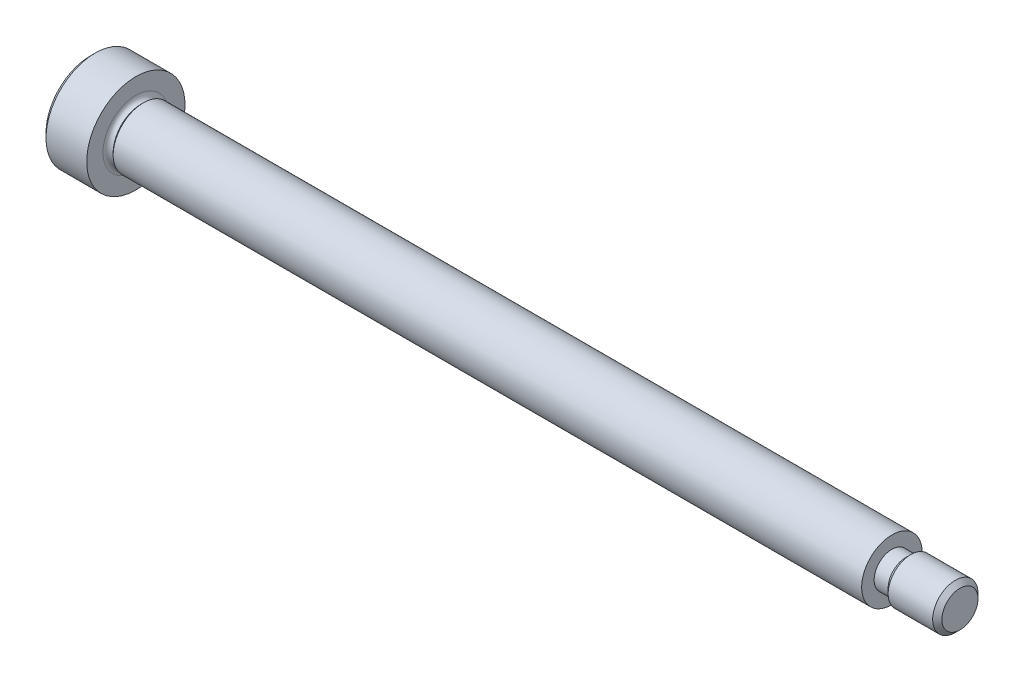
ISO-10303-21;
HEADER;
FILE_DESCRIPTION(('STEP AP214'),'2;1');
FILE_NAME('part.step','',(''),(''),'','','');
FILE_SCHEMA(('AUTOMOTIVE_DESIGN { 1 0 10303 214 1 1 1 1 }'));
ENDSEC;
DATA;
#1=APPLICATION_CONTEXT('core data for automotive mechanical design processes');
#2=APPLICATION_PROTOCOL_DEFINITION('international standard','automotive_design',2000,#1);
#3=PRODUCT_CONTEXT('',#1,'mechanical');
#4=PRODUCT('Part','Part','',(#3));
#5=PRODUCT_RELATED_PRODUCT_CATEGORY('part','',(#4));
#6=PRODUCT_DEFINITION_FORMATION('','',#4);
#7=PRODUCT_DEFINITION_CONTEXT('part definition',#1,'design');
#8=PRODUCT_DEFINITION('design','',#6,#7);
#9=PRODUCT_DEFINITION_SHAPE('','',#8);
#10=(LENGTH_UNIT() NAMED_UNIT(*) SI_UNIT(.MILLI.,.METRE.));
#11=(NAMED_UNIT(*) PLANE_ANGLE_UNIT() SI_UNIT($,.RADIAN.));
#12=(NAMED_UNIT(*) SI_UNIT($,.STERADIAN.) SOLID_ANGLE_UNIT());
#13=UNCERTAINTY_MEASURE_WITH_UNIT(LENGTH_MEASURE(1.E-05),#10,'distance_accuracy_value','');
#14=(GEOMETRIC_REPRESENTATION_CONTEXT(3) GLOBAL_UNCERTAINTY_ASSIGNED_CONTEXT((#13)) GLOBAL_UNIT_ASSIGNED_CONTEXT((#10,
#11,#12)) REPRESENTATION_CONTEXT('',''));
#15=CARTESIAN_POINT('',(0.,0.,0.));
#16=DIRECTION('',(0.,0.,1.));
#17=DIRECTION('',(1.,0.,0.));
#18=AXIS2_PLACEMENT_3D('',#15,#16,#17);
#19=CARTESIAN_POINT('',(-3.,0.,0.));
#20=DIRECTION('',(-1.,0.,0.));
#21=DIRECTION('',(0.,0.,1.));
#22=AXIS2_PLACEMENT_3D('',#19,#20,#21);
#23=PLANE('',#22);
#24=DIRECTION('',(0.,0.500000000000001,-0.866025403784438));
#25=VECTOR('',#24,1.);
#26=CARTESIAN_POINT('',(-3.,1.44337567297406,2.5));
#27=LINE('',#26,#25);
#28=CARTESIAN_POINT('',(-3.,1.44337567297406,2.5));
#29=VERTEX_POINT('',#28);
#30=CARTESIAN_POINT('',(-2.99999999994751,2.16506350946109,1.25));
#31=VERTEX_POINT('',#30);
#32=EDGE_CURVE('E160',#29,#31,#27,.T.);
#33=ORIENTED_EDGE('',*,*,#32,.T.);
#34=CARTESIAN_POINT('',(-2.99999999994751,0.,0.));
#35=DIRECTION('',(1.,0.,0.));
#36=DIRECTION('',(0.,1.,0.));
#37=AXIS2_PLACEMENT_3D('',#34,#35,#36);
#38=CIRCLE('',#37,2.50000000005271);
#39=CARTESIAN_POINT('',(-2.99999999994751,0.,2.50000000005271));
#40=VERTEX_POINT('',#39);
#41=EDGE_CURVE('E50',#31,#40,#38,.T.);
#42=ORIENTED_EDGE('',*,*,#41,.T.);
#43=DIRECTION('',(0.,1.,0.));
#44=VECTOR('',#43,1.);
#45=CARTESIAN_POINT('',(-3.,-1.44337567297406,2.5));
#46=LINE('',#45,#44);
#47=EDGE_CURVE('E460',#40,#29,#46,.T.);
#48=ORIENTED_EDGE('',*,*,#47,.T.);
#49=EDGE_LOOP('',(#33,#42,#48));
#50=FACE_BOUND('',#49,.T.);
#51=ADVANCED_FACE('F35',(#50),#23,.T.);
#52=CARTESIAN_POINT('',(-3.,-1.44337567297406,2.5));
#53=VERTEX_POINT('',#52);
#54=EDGE_CURVE('E461',#53,#40,#46,.T.);
#55=ORIENTED_EDGE('',*,*,#54,.T.);
#56=CARTESIAN_POINT('',(-2.99999999994751,-2.16506350950675,1.25000000002636));
#57=VERTEX_POINT('',#56);
#58=EDGE_CURVE('E222',#40,#57,#38,.T.);
#59=ORIENTED_EDGE('',*,*,#58,.T.);
#60=DIRECTION('',(0.,0.5,0.866025403784438));
#61=VECTOR('',#60,1.);
#62=CARTESIAN_POINT('',(-3.,-2.88675134594813,0.));
#63=LINE('',#62,#61);
#64=EDGE_CURVE('E457',#57,#53,#63,.T.);
#65=ORIENTED_EDGE('',*,*,#64,.T.);
#66=EDGE_LOOP('',(#55,#59,#65));
#67=FACE_BOUND('',#66,.T.);
#68=ADVANCED_FACE('F123',(#67),#23,.T.);
#69=CARTESIAN_POINT('',(-3.,-2.88675134594813,0.));
#70=VERTEX_POINT('',#69);
#71=EDGE_CURVE('E449',#70,#57,#63,.T.);
#72=ORIENTED_EDGE('',*,*,#71,.T.);
#73=CARTESIAN_POINT('',(-2.99999999994751,-2.16506350950674,-1.25000000002636));
#74=VERTEX_POINT('',#73);
#75=EDGE_CURVE('E469',#57,#74,#38,.T.);
#76=ORIENTED_EDGE('',*,*,#75,.T.);
#77=DIRECTION('',(0.,-0.500000000000001,0.866025403784438));
#78=VECTOR('',#77,1.);
#79=CARTESIAN_POINT('',(-3.,-1.44337567297406,-2.5));
#80=LINE('',#79,#78);
#81=EDGE_CURVE('E182',#74,#70,#80,.T.);
#82=ORIENTED_EDGE('',*,*,#81,.T.);
#83=EDGE_LOOP('',(#72,#76,#82));
#84=FACE_BOUND('',#83,.T.);
#85=ADVANCED_FACE('F129',(#84),#23,.T.);
#86=CARTESIAN_POINT('',(-3.,-1.44337567297406,-2.5));
#87=VERTEX_POINT('',#86);
#88=EDGE_CURVE('E452',#87,#74,#80,.T.);
#89=ORIENTED_EDGE('',*,*,#88,.T.);
#90=CARTESIAN_POINT('',(-2.99999999994751,0.,-2.50000000005271));
#91=VERTEX_POINT('',#90);
#92=EDGE_CURVE('E456',#74,#91,#38,.T.);
#93=ORIENTED_EDGE('',*,*,#92,.T.);
#94=DIRECTION('',(0.,-1.,0.));
#95=VECTOR('',#94,1.);
#96=CARTESIAN_POINT('',(-3.,1.44337567297406,-2.5));
#97=LINE('',#96,#95);
#98=EDGE_CURVE('E155',#91,#87,#97,.T.);
#99=ORIENTED_EDGE('',*,*,#98,.T.);
#100=EDGE_LOOP('',(#89,#93,#99));
#101=FACE_BOUND('',#100,.T.);
#102=ADVANCED_FACE('F144',(#101),#23,.T.);
#103=CARTESIAN_POINT('',(-3.,1.44337567297406,-2.5));
#104=VERTEX_POINT('',#103);
#105=EDGE_CURVE('E158',#104,#91,#97,.T.);
#106=ORIENTED_EDGE('',*,*,#105,.T.);
#107=CARTESIAN_POINT('',(-2.99999999994751,2.16506350950674,-1.25000000002636));
#108=VERTEX_POINT('',#107);
#109=EDGE_CURVE('E468',#91,#108,#38,.T.);
#110=ORIENTED_EDGE('',*,*,#109,.T.);
#111=DIRECTION('',(0.,-0.500000000000001,-0.866025403784438));
#112=VECTOR('',#111,1.);
#113=CARTESIAN_POINT('',(-3.,2.88675134594813,0.));
#114=LINE('',#113,#112);
#115=EDGE_CURVE('E156',#108,#104,#114,.T.);
#116=ORIENTED_EDGE('',*,*,#115,.T.);
#117=EDGE_LOOP('',(#106,#110,#116));
#118=FACE_BOUND('',#117,.T.);
#119=ADVANCED_FACE('F135',(#118),#23,.T.);
#120=CARTESIAN_POINT('',(-3.,2.88675134594813,0.));
#121=VERTEX_POINT('',#120);
#122=EDGE_CURVE('E148',#121,#108,#114,.T.);
#123=ORIENTED_EDGE('',*,*,#122,.T.);
#124=EDGE_CURVE('E149',#108,#31,#38,.T.);
#125=ORIENTED_EDGE('',*,*,#124,.T.);
#126=EDGE_CURVE('E151',#31,#121,#27,.T.);
#127=ORIENTED_EDGE('',*,*,#126,.T.);
#128=EDGE_LOOP('',(#123,#125,#127));
#129=FACE_BOUND('',#128,.T.);
#130=ADVANCED_FACE('F125',(#129),#23,.T.);
#131=CARTESIAN_POINT('',(100.,0.,0.));
#132=DIRECTION('',(1.,0.,0.));
#133=DIRECTION('',(0.,0.,-1.));
#134=AXIS2_PLACEMENT_3D('',#131,#132,#133);
#135=PLANE('',#134);
#136=CARTESIAN_POINT('',(100.,0.,0.));
#137=DIRECTION('',(1.,0.,0.));
#138=DIRECTION('',(0.,0.,-1.));
#139=AXIS2_PLACEMENT_3D('',#136,#137,#138);
#140=CIRCLE('',#139,4.00000000000323);
#141=CARTESIAN_POINT('',(100.,0.,-4.00000000000323));
#142=VERTEX_POINT('',#141);
#143=EDGE_CURVE('E201',#142,#142,#140,.T.);
#144=ORIENTED_EDGE('',*,*,#143,.T.);
#145=EDGE_LOOP('',(#144));
#146=FACE_BOUND('',#145,.T.);
#147=CARTESIAN_POINT('',(100.,0.,0.));
#148=DIRECTION('',(1.,0.,0.));
#149=DIRECTION('',(0.,0.,-1.));
#150=AXIS2_PLACEMENT_3D('',#147,#148,#149);
#151=CIRCLE('',#150,2.35);
#152=CARTESIAN_POINT('',(100.,0.,2.35));
#153=VERTEX_POINT('',#152);
#154=EDGE_CURVE('E197',#153,#153,#151,.T.);
#155=ORIENTED_EDGE('',*,*,#154,.F.);
#156=EDGE_LOOP('',(#155));
#157=FACE_BOUND('',#156,.T.);
#158=ADVANCED_FACE('F134',(#146,#157),#135,.T.);
#159=CARTESIAN_POINT('',(-6.,0.,0.));
#160=DIRECTION('',(1.,0.,0.));
#161=DIRECTION('',(0.,0.,-1.));
#162=AXIS2_PLACEMENT_3D('',#159,#160,#161);
#163=CYLINDRICAL_SURFACE('',#162,6.5);
#164=CARTESIAN_POINT('',(-5.38650000007122,0.,0.));
#165=DIRECTION('',(-1.,0.,0.));
#166=DIRECTION('',(0.,0.,1.));
#167=AXIS2_PLACEMENT_3D('',#164,#165,#166);
#168=CIRCLE('',#167,6.5);
#169=CARTESIAN_POINT('',(-5.38650000007122,0.,6.5));
#170=VERTEX_POINT('',#169);
#171=EDGE_CURVE('E218',#170,#170,#168,.F.);
#172=ORIENTED_EDGE('',*,*,#171,.T.);
#173=EDGE_LOOP('',(#172));
#174=FACE_BOUND('',#173,.T.);
#175=CARTESIAN_POINT('',(0.,0.,0.));
#176=DIRECTION('',(1.,0.,0.));
#177=DIRECTION('',(0.,0.,-1.));
#178=AXIS2_PLACEMENT_3D('',#175,#176,#177);
#179=CIRCLE('',#178,6.5);
#180=CARTESIAN_POINT('',(0.,0.,-6.5));
#181=VERTEX_POINT('',#180);
#182=EDGE_CURVE('E215',#181,#181,#179,.T.);
#183=ORIENTED_EDGE('',*,*,#182,.F.);
#184=EDGE_LOOP('',(#183));
#185=FACE_BOUND('',#184,.T.);
#186=ADVANCED_FACE('F141',(#174,#185),#163,.T.);
#187=CARTESIAN_POINT('',(0.,4.35,0.));
#188=DIRECTION('',(1.,0.,0.));
#189=DIRECTION('',(0.,0.,-1.));
#190=AXIS2_PLACEMENT_3D('',#187,#188,#189);
#191=PLANE('',#190);
#192=ORIENTED_EDGE('',*,*,#182,.T.);
#193=EDGE_LOOP('',(#192));
#194=FACE_BOUND('',#193,.T.);
#195=CARTESIAN_POINT('',(0.,0.,0.));
#196=DIRECTION('',(1.,0.,0.));
#197=DIRECTION('',(0.,0.,-1.));
#198=AXIS2_PLACEMENT_3D('',#195,#196,#197);
#199=CIRCLE('',#198,4.35);
#200=CARTESIAN_POINT('',(0.,0.,-4.35));
#201=VERTEX_POINT('',#200);
#202=EDGE_CURVE('E212',#201,#201,#199,.T.);
#203=ORIENTED_EDGE('',*,*,#202,.F.);
#204=EDGE_LOOP('',(#203));
#205=FACE_BOUND('',#204,.T.);
#206=ADVANCED_FACE('F271',(#194,#205),#191,.T.);
#207=CARTESIAN_POINT('',(0.63058688003833,0.,0.));
#208=DIRECTION('',(1.,0.,0.));
#209=DIRECTION('',(0.,0.,-1.));
#210=AXIS2_PLACEMENT_3D('',#207,#208,#209);
#211=TOROIDAL_SURFACE('',#210,4.32717048621621,0.630999999981046);
#212=ORIENTED_EDGE('',*,*,#202,.T.);
#213=EDGE_LOOP('',(#212));
#214=FACE_BOUND('',#213,.T.);
#215=CARTESIAN_POINT('',(0.699999999977959,0.,0.));
#216=DIRECTION('',(1.,0.,0.));
#217=DIRECTION('',(0.,0.,-1.));
#218=AXIS2_PLACEMENT_3D('',#215,#216,#217);
#219=CIRCLE('',#218,3.70000000001941);
#220=CARTESIAN_POINT('',(0.699999999977959,0.,-3.70000000001941));
#221=VERTEX_POINT('',#220);
#222=EDGE_CURVE('E209',#221,#221,#219,.T.);
#223=ORIENTED_EDGE('',*,*,#222,.F.);
#224=EDGE_LOOP('',(#223));
#225=FACE_BOUND('',#224,.T.);
#226=ADVANCED_FACE('F267',(#214,#225),#211,.F.);
#227=CARTESIAN_POINT('',(0.99999999996177,0.,0.));
#228=DIRECTION('',(1.,0.,0.));
#229=DIRECTION('',(0.,0.,-1.));
#230=AXIS2_PLACEMENT_3D('',#227,#228,#229);
#231=CONICAL_SURFACE('',#230,4.00000000000322,0.785398163397448);
#232=ORIENTED_EDGE('',*,*,#222,.T.);
#233=EDGE_LOOP('',(#232));
#234=FACE_BOUND('',#233,.T.);
#235=CARTESIAN_POINT('',(0.99999999996177,0.,0.));
#236=DIRECTION('',(1.,0.,0.));
#237=DIRECTION('',(0.,0.,-1.));
#238=AXIS2_PLACEMENT_3D('',#235,#236,#237);
#239=CIRCLE('',#238,4.00000000000322);
#240=CARTESIAN_POINT('',(0.99999999996177,0.,-4.00000000000322));
#241=VERTEX_POINT('',#240);
#242=EDGE_CURVE('E206',#241,#241,#239,.T.);
#243=ORIENTED_EDGE('',*,*,#242,.F.);
#244=EDGE_LOOP('',(#243));
#245=FACE_BOUND('',#244,.T.);
#246=ADVANCED_FACE('F263',(#234,#245),#231,.T.);
#247=CARTESIAN_POINT('',(-6.,0.,0.));
#248=DIRECTION('',(1.,0.,0.));
#249=DIRECTION('',(0.,0.,-1.));
#250=AXIS2_PLACEMENT_3D('',#247,#248,#249);
#251=CYLINDRICAL_SURFACE('',#250,4.00000000000323);
#252=ORIENTED_EDGE('',*,*,#242,.T.);
#253=EDGE_LOOP('',(#252));
#254=FACE_BOUND('',#253,.T.);
#255=ORIENTED_EDGE('',*,*,#143,.F.);
#256=EDGE_LOOP('',(#255));
#257=FACE_BOUND('',#256,.T.);
#258=ADVANCED_FACE('F257',(#254,#257),#251,.T.);
#259=CARTESIAN_POINT('',(-6.,6.5,0.));
#260=DIRECTION('',(-1.,0.,0.));
#261=DIRECTION('',(0.,0.,1.));
#262=AXIS2_PLACEMENT_3D('',#259,#260,#261);
#263=PLANE('',#262);
#264=CARTESIAN_POINT('',(-6.,0.,0.));
#265=DIRECTION('',(-1.,0.,0.));
#266=DIRECTION('',(0.,0.,1.));
#267=AXIS2_PLACEMENT_3D('',#264,#265,#266);
#268=CIRCLE('',#267,5.88650000001438);
#269=CARTESIAN_POINT('',(-6.,0.,5.88650000001438));
#270=VERTEX_POINT('',#269);
#271=EDGE_CURVE('E221',#270,#270,#268,.T.);
#272=ORIENTED_EDGE('',*,*,#271,.T.);
#273=EDGE_LOOP('',(#272));
#274=FACE_BOUND('',#273,.T.);
#275=DIRECTION('',(0.,-0.500000000000001,0.866025403784438));
#276=VECTOR('',#275,1.);
#277=CARTESIAN_POINT('',(-6.,-1.44337567297406,-2.5));
#278=LINE('',#277,#276);
#279=CARTESIAN_POINT('',(-6.,-1.44337567297406,-2.5));
#280=VERTEX_POINT('',#279);
#281=CARTESIAN_POINT('',(-6.,-2.88675134594813,0.));
#282=VERTEX_POINT('',#281);
#283=EDGE_CURVE('E58',#280,#282,#278,.T.);
#284=ORIENTED_EDGE('',*,*,#283,.F.);
#285=DIRECTION('',(0.,-1.,0.));
#286=VECTOR('',#285,1.);
#287=CARTESIAN_POINT('',(-6.,1.44337567297406,-2.5));
#288=LINE('',#287,#286);
#289=CARTESIAN_POINT('',(-6.,1.44337567297406,-2.5));
#290=VERTEX_POINT('',#289);
#291=EDGE_CURVE('E179',#290,#280,#288,.T.);
#292=ORIENTED_EDGE('',*,*,#291,.F.);
#293=DIRECTION('',(0.,-0.500000000000001,-0.866025403784438));
#294=VECTOR('',#293,1.);
#295=CARTESIAN_POINT('',(-6.,2.88675134594813,0.));
#296=LINE('',#295,#294);
#297=CARTESIAN_POINT('',(-6.,2.88675134594813,0.));
#298=VERTEX_POINT('',#297);
#299=EDGE_CURVE('E176',#298,#290,#296,.T.);
#300=ORIENTED_EDGE('',*,*,#299,.F.);
#301=DIRECTION('',(0.,0.500000000000001,-0.866025403784438));
#302=VECTOR('',#301,1.);
#303=CARTESIAN_POINT('',(-6.,1.44337567297406,2.5));
#304=LINE('',#303,#302);
#305=CARTESIAN_POINT('',(-6.,1.44337567297406,2.5));
#306=VERTEX_POINT('',#305);
#307=EDGE_CURVE('E173',#306,#298,#304,.T.);
#308=ORIENTED_EDGE('',*,*,#307,.F.);
#309=DIRECTION('',(0.,1.,0.));
#310=VECTOR('',#309,1.);
#311=CARTESIAN_POINT('',(-6.,-1.44337567297406,2.5));
#312=LINE('',#311,#310);
#313=CARTESIAN_POINT('',(-6.,-1.44337567297406,2.5));
#314=VERTEX_POINT('',#313);
#315=EDGE_CURVE('E170',#314,#306,#312,.T.);
#316=ORIENTED_EDGE('',*,*,#315,.F.);
#317=DIRECTION('',(0.,0.5,0.866025403784438));
#318=VECTOR('',#317,1.);
#319=CARTESIAN_POINT('',(-6.,-2.88675134594813,0.));
#320=LINE('',#319,#318);
#321=EDGE_CURVE('E167',#282,#314,#320,.T.);
#322=ORIENTED_EDGE('',*,*,#321,.F.);
#323=EDGE_LOOP('',(#284,#292,#300,#308,#316,#322));
#324=FACE_BOUND('',#323,.T.);
#325=ADVANCED_FACE('F250',(#274,#324),#263,.T.);
#326=CARTESIAN_POINT('',(101.85,0.,0.));
#327=DIRECTION('',(-1.,0.,0.));
#328=DIRECTION('',(0.,0.,1.));
#329=AXIS2_PLACEMENT_3D('',#326,#327,#328);
#330=CYLINDRICAL_SURFACE('',#329,2.35);
#331=CARTESIAN_POINT('',(101.85,0.,0.));
#332=DIRECTION('',(1.,0.,0.));
#333=DIRECTION('',(0.,0.,-1.));
#334=AXIS2_PLACEMENT_3D('',#331,#332,#333);
#335=CIRCLE('',#334,2.35);
#336=CARTESIAN_POINT('',(101.85,0.,2.35));
#337=VERTEX_POINT('',#336);
#338=EDGE_CURVE('E198',#337,#337,#335,.T.);
#339=CARTESIAN_POINT('',(101.85,0.,2.35));
#340=CARTESIAN_POINT('',(101.830729166667,0.,2.35));
#341=CARTESIAN_POINT('',(101.811458333333,0.,2.35));
#342=CARTESIAN_POINT('',(101.772916666667,0.,2.35));
#343=CARTESIAN_POINT('',(101.753645833333,0.,2.35));
#344=CARTESIAN_POINT('',(101.715104166667,0.,2.35));
#345=CARTESIAN_POINT('',(101.695833333333,0.,2.35));
#346=CARTESIAN_POINT('',(101.657291666667,0.,2.35));
#347=CARTESIAN_POINT('',(101.638020833333,0.,2.35));
#348=CARTESIAN_POINT('',(101.599479166667,0.,2.35));
#349=CARTESIAN_POINT('',(101.580208333333,0.,2.35));
#350=CARTESIAN_POINT('',(101.541666666667,0.,2.35));
#351=CARTESIAN_POINT('',(101.522395833333,0.,2.35));
#352=CARTESIAN_POINT('',(101.483854166667,0.,2.35));
#353=CARTESIAN_POINT('',(101.464583333333,0.,2.35));
#354=CARTESIAN_POINT('',(101.426041666667,0.,2.35));
#355=CARTESIAN_POINT('',(101.406770833333,0.,2.35));
#356=CARTESIAN_POINT('',(101.368229166667,0.,2.35));
#357=CARTESIAN_POINT('',(101.348958333333,0.,2.35));
#358=CARTESIAN_POINT('',(101.310416666667,0.,2.35));
#359=CARTESIAN_POINT('',(101.291145833333,0.,2.35));
#360=CARTESIAN_POINT('',(101.252604166667,0.,2.35));
#361=CARTESIAN_POINT('',(101.233333333333,0.,2.35));
#362=CARTESIAN_POINT('',(101.194791666667,0.,2.35));
#363=CARTESIAN_POINT('',(101.175520833333,0.,2.35));
#364=CARTESIAN_POINT('',(101.136979166667,0.,2.35));
#365=CARTESIAN_POINT('',(101.117708333333,0.,2.35));
#366=CARTESIAN_POINT('',(101.079166666667,0.,2.35));
#367=CARTESIAN_POINT('',(101.059895833333,0.,2.35));
#368=CARTESIAN_POINT('',(101.021354166667,0.,2.35));
#369=CARTESIAN_POINT('',(101.002083333333,0.,2.35));
#370=CARTESIAN_POINT('',(100.963541666667,0.,2.35));
#371=CARTESIAN_POINT('',(100.944270833333,0.,2.35));
#372=CARTESIAN_POINT('',(100.905729166667,0.,2.35));
#373=CARTESIAN_POINT('',(100.886458333333,0.,2.35));
#374=CARTESIAN_POINT('',(100.847916666667,0.,2.35));
#375=CARTESIAN_POINT('',(100.828645833333,0.,2.35));
#376=CARTESIAN_POINT('',(100.790104166667,0.,2.35));
#377=CARTESIAN_POINT('',(100.770833333333,0.,2.35));
#378=CARTESIAN_POINT('',(100.732291666667,0.,2.35));
#379=CARTESIAN_POINT('',(100.713020833333,0.,2.35));
#380=CARTESIAN_POINT('',(100.674479166667,0.,2.35));
#381=CARTESIAN_POINT('',(100.655208333333,0.,2.35));
#382=CARTESIAN_POINT('',(100.616666666667,0.,2.35));
#383=CARTESIAN_POINT('',(100.597395833333,0.,2.35));
#384=CARTESIAN_POINT('',(100.558854166667,0.,2.35));
#385=CARTESIAN_POINT('',(100.539583333333,0.,2.35));
#386=CARTESIAN_POINT('',(100.501041666667,0.,2.35));
#387=CARTESIAN_POINT('',(100.481770833333,0.,2.35));
#388=CARTESIAN_POINT('',(100.443229166667,0.,2.35));
#389=CARTESIAN_POINT('',(100.423958333333,0.,2.35));
#390=CARTESIAN_POINT('',(100.385416666667,0.,2.35));
#391=CARTESIAN_POINT('',(100.366145833333,0.,2.35));
#392=CARTESIAN_POINT('',(100.327604166667,0.,2.35));
#393=CARTESIAN_POINT('',(100.308333333333,0.,2.35));
#394=CARTESIAN_POINT('',(100.269791666667,0.,2.35));
#395=CARTESIAN_POINT('',(100.250520833333,0.,2.35));
#396=CARTESIAN_POINT('',(100.211979166667,0.,2.35));
#397=CARTESIAN_POINT('',(100.192708333333,0.,2.35));
#398=CARTESIAN_POINT('',(100.154166666667,0.,2.35));
#399=CARTESIAN_POINT('',(100.134895833333,0.,2.35));
#400=CARTESIAN_POINT('',(100.096354166667,0.,2.35));
#401=CARTESIAN_POINT('',(100.077083333333,0.,2.35));
#402=CARTESIAN_POINT('',(100.038541666667,0.,2.35));
#403=CARTESIAN_POINT('',(100.019270833333,0.,2.35));
#404=CARTESIAN_POINT('',(100.,0.,2.35));
#405=B_SPLINE_CURVE_WITH_KNOTS('',3,(#339,#340,#341,#342,#343,#344,#345,#346,#347,#348,#349,
#350,#351,#352,#353,#354,#355,#356,#357,#358,#359,#360,#361,#362,#363,#364,#365,#366,#367,#368,
#369,#370,#371,#372,#373,#374,#375,#376,#377,#378,#379,#380,#381,#382,#383,#384,#385,#386,#387,
#388,#389,#390,#391,#392,#393,#394,#395,#396,#397,#398,#399,#400,#401,#402,#403,#404),
.UNSPECIFIED.,.F.,.F.,(4,2,2,2,2,2,2,2,2,2,2,2,2,2,2,2,2,2,2,2,2,2,2,2,2,2,2,2,2,2,2,2,4),(0.,
0.057812500000004,0.115625000000008,0.173437500000012,0.231250000000002,0.289062500000006,
0.34687500000001,0.404687500000001,0.462500000000005,0.520312500000009,0.578124999999999,
0.635937500000003,0.693750000000007,0.751562499999997,0.809375000000001,0.867187500000005,
0.924999999999995,0.982812499999999,1.040625,1.09843750000001,1.15625,1.2140625,
1.27187500000001,1.3296875,1.3875,1.4453125,1.50312499999999,1.5609375,1.61875,1.67656249999999,
1.734375,1.7921875,1.84999999999999),.UNSPECIFIED.);
#406=EDGE_CURVE('BSEAM244',#337,#153,#405,.T.);
#407=ORIENTED_EDGE('',*,*,#338,.F.);
#408=ORIENTED_EDGE('',*,*,#154,.T.);
#409=ORIENTED_EDGE('',*,*,#406,.T.);
#410=ORIENTED_EDGE('',*,*,#406,.F.);
#411=EDGE_LOOP('',(#407,#409,#408,#410));
#412=FACE_BOUND('',#411,.T.);
#413=ADVANCED_FACE('F244',(#412),#330,.T.);
#414=CARTESIAN_POINT('',(101.85,0.,0.));
#415=DIRECTION('',(1.,0.,0.));
#416=DIRECTION('',(0.,0.,-1.));
#417=AXIS2_PLACEMENT_3D('',#414,#415,#416);
#418=CONICAL_SURFACE('',#417,2.34999999997453,0.785398163397452);
#419=CARTESIAN_POINT('',(102.500000000011,0.,0.));
#420=DIRECTION('',(1.,0.,0.));
#421=DIRECTION('',(0.,0.,-1.));
#422=AXIS2_PLACEMENT_3D('',#419,#420,#421);
#423=CIRCLE('',#422,2.99999999998591);
#424=CARTESIAN_POINT('',(102.500000000011,0.,-2.99999999998591));
#425=VERTEX_POINT('',#424);
#426=EDGE_CURVE('E185',#425,#425,#423,.T.);
#427=ORIENTED_EDGE('',*,*,#426,.F.);
#428=EDGE_LOOP('',(#427));
#429=FACE_BOUND('',#428,.T.);
#430=ORIENTED_EDGE('',*,*,#338,.T.);
#431=EDGE_LOOP('',(#430));
#432=FACE_BOUND('',#431,.T.);
#433=ADVANCED_FACE('F238',(#429,#432),#418,.T.);
#434=CARTESIAN_POINT('',(109.,0.,0.));
#435=DIRECTION('',(-1.,0.,0.));
#436=DIRECTION('',(0.,0.,1.));
#437=AXIS2_PLACEMENT_3D('',#434,#435,#436);
#438=CYLINDRICAL_SURFACE('',#437,3.);
#439=CARTESIAN_POINT('',(108.386500000014,0.,0.));
#440=DIRECTION('',(1.,0.,0.));
#441=DIRECTION('',(0.,0.,-1.));
#442=AXIS2_PLACEMENT_3D('',#439,#440,#441);
#443=CIRCLE('',#442,3.);
#444=CARTESIAN_POINT('',(108.386500000014,0.,-3.));
#445=VERTEX_POINT('',#444);
#446=EDGE_CURVE('E11',#445,#445,#443,.F.);
#447=ORIENTED_EDGE('',*,*,#446,.T.);
#448=EDGE_LOOP('',(#447));
#449=FACE_BOUND('',#448,.T.);
#450=ORIENTED_EDGE('',*,*,#426,.T.);
#451=EDGE_LOOP('',(#450));
#452=FACE_BOUND('',#451,.T.);
#453=ADVANCED_FACE('F235',(#449,#452),#438,.T.);
#454=CARTESIAN_POINT('',(109.,0.,0.));
#455=DIRECTION('',(1.,0.,0.));
#456=DIRECTION('',(0.,0.,-1.));
#457=AXIS2_PLACEMENT_3D('',#454,#455,#456);
#458=PLANE('',#457);
#459=CARTESIAN_POINT('',(109.,0.,0.));
#460=DIRECTION('',(1.,0.,0.));
#461=DIRECTION('',(0.,0.,-1.));
#462=AXIS2_PLACEMENT_3D('',#459,#460,#461);
#463=CIRCLE('',#462,2.38650000007123);
#464=CARTESIAN_POINT('',(109.,0.,-2.38650000007123));
#465=VERTEX_POINT('',#464);
#466=EDGE_CURVE('E43',#465,#465,#463,.T.);
#467=ORIENTED_EDGE('',*,*,#466,.T.);
#468=EDGE_LOOP('',(#467));
#469=FACE_BOUND('',#468,.T.);
#470=ADVANCED_FACE('F227',(#469),#458,.T.);
#471=CARTESIAN_POINT('',(-3.,-1.44337567297406,-2.5));
#472=DIRECTION('',(0.,-0.866025403784438,-0.500000000000001));
#473=DIRECTION('',(0.,0.500000000000001,-0.866025403784438));
#474=AXIS2_PLACEMENT_3D('',#471,#472,#473);
#475=PLANE('',#474);
#476=ORIENTED_EDGE('',*,*,#283,.T.);
#477=DIRECTION('',(-1.,0.,0.));
#478=VECTOR('',#477,1.);
#479=CARTESIAN_POINT('',(-3.,-2.88675134594813,0.));
#480=LINE('',#479,#478);
#481=EDGE_CURVE('E165',#70,#282,#480,.T.);
#482=ORIENTED_EDGE('',*,*,#481,.F.);
#483=ORIENTED_EDGE('',*,*,#81,.F.);
#484=ORIENTED_EDGE('',*,*,#88,.F.);
#485=DIRECTION('',(-1.,0.,0.));
#486=VECTOR('',#485,1.);
#487=CARTESIAN_POINT('',(-3.,-1.44337567297406,-2.5));
#488=LINE('',#487,#486);
#489=EDGE_CURVE('E183',#87,#280,#488,.T.);
#490=ORIENTED_EDGE('',*,*,#489,.T.);
#491=EDGE_LOOP('',(#476,#482,#483,#484,#490));
#492=FACE_BOUND('',#491,.T.);
#493=ADVANCED_FACE('F331',(#492),#475,.F.);
#494=CARTESIAN_POINT('',(-3.,1.44337567297406,-2.5));
#495=DIRECTION('',(0.,0.,-1.));
#496=DIRECTION('',(0.,1.,0.));
#497=AXIS2_PLACEMENT_3D('',#494,#495,#496);
#498=PLANE('',#497);
#499=ORIENTED_EDGE('',*,*,#291,.T.);
#500=ORIENTED_EDGE('',*,*,#489,.F.);
#501=ORIENTED_EDGE('',*,*,#98,.F.);
#502=ORIENTED_EDGE('',*,*,#105,.F.);
#503=DIRECTION('',(-1.,0.,0.));
#504=VECTOR('',#503,1.);
#505=CARTESIAN_POINT('',(-3.,1.44337567297406,-2.5));
#506=LINE('',#505,#504);
#507=EDGE_CURVE('E186',#104,#290,#506,.T.);
#508=ORIENTED_EDGE('',*,*,#507,.T.);
#509=EDGE_LOOP('',(#499,#500,#501,#502,#508));
#510=FACE_BOUND('',#509,.T.);
#511=ADVANCED_FACE('F414',(#510),#498,.F.);
#512=CARTESIAN_POINT('',(-3.,2.88675134594813,0.));
#513=DIRECTION('',(0.,0.866025403784438,-0.500000000000001));
#514=DIRECTION('',(0.,0.500000000000001,0.866025403784438));
#515=AXIS2_PLACEMENT_3D('',#512,#513,#514);
#516=PLANE('',#515);
#517=ORIENTED_EDGE('',*,*,#299,.T.);
#518=ORIENTED_EDGE('',*,*,#507,.F.);
#519=ORIENTED_EDGE('',*,*,#115,.F.);
#520=ORIENTED_EDGE('',*,*,#122,.F.);
#521=DIRECTION('',(-1.,0.,0.));
#522=VECTOR('',#521,1.);
#523=CARTESIAN_POINT('',(-3.,2.88675134594813,0.));
#524=LINE('',#523,#522);
#525=EDGE_CURVE('E188',#121,#298,#524,.T.);
#526=ORIENTED_EDGE('',*,*,#525,.T.);
#527=EDGE_LOOP('',(#517,#518,#519,#520,#526));
#528=FACE_BOUND('',#527,.T.);
#529=ADVANCED_FACE('F405',(#528),#516,.F.);
#530=CARTESIAN_POINT('',(-3.,1.44337567297406,2.5));
#531=DIRECTION('',(0.,0.866025403784438,0.500000000000001));
#532=DIRECTION('',(0.,-0.500000000000001,0.866025403784438));
#533=AXIS2_PLACEMENT_3D('',#530,#531,#532);
#534=PLANE('',#533);
#535=ORIENTED_EDGE('',*,*,#307,.T.);
#536=ORIENTED_EDGE('',*,*,#525,.F.);
#537=ORIENTED_EDGE('',*,*,#126,.F.);
#538=ORIENTED_EDGE('',*,*,#32,.F.);
#539=DIRECTION('',(-1.,0.,0.));
#540=VECTOR('',#539,1.);
#541=CARTESIAN_POINT('',(-3.,1.44337567297406,2.5));
#542=LINE('',#541,#540);
#543=EDGE_CURVE('E190',#29,#306,#542,.T.);
#544=ORIENTED_EDGE('',*,*,#543,.T.);
#545=EDGE_LOOP('',(#535,#536,#537,#538,#544));
#546=FACE_BOUND('',#545,.T.);
#547=ADVANCED_FACE('F396',(#546),#534,.F.);
#548=CARTESIAN_POINT('',(-3.,-1.44337567297406,2.5));
#549=DIRECTION('',(0.,0.,1.));
#550=DIRECTION('',(0.,-1.,0.));
#551=AXIS2_PLACEMENT_3D('',#548,#549,#550);
#552=PLANE('',#551);
#553=ORIENTED_EDGE('',*,*,#315,.T.);
#554=ORIENTED_EDGE('',*,*,#543,.F.);
#555=ORIENTED_EDGE('',*,*,#47,.F.);
#556=ORIENTED_EDGE('',*,*,#54,.F.);
#557=DIRECTION('',(-1.,0.,0.));
#558=VECTOR('',#557,1.);
#559=CARTESIAN_POINT('',(-3.,-1.44337567297406,2.5));
#560=LINE('',#559,#558);
#561=EDGE_CURVE('E192',#53,#314,#560,.T.);
#562=ORIENTED_EDGE('',*,*,#561,.T.);
#563=EDGE_LOOP('',(#553,#554,#555,#556,#562));
#564=FACE_BOUND('',#563,.T.);
#565=ADVANCED_FACE('F118',(#564),#552,.F.);
#566=CARTESIAN_POINT('',(-3.,-2.88675134594813,0.));
#567=DIRECTION('',(0.,-0.866025403784438,0.500000000000001));
#568=DIRECTION('',(0.,-0.500000000000001,-0.866025403784438));
#569=AXIS2_PLACEMENT_3D('',#566,#567,#568);
#570=PLANE('',#569);
#571=ORIENTED_EDGE('',*,*,#321,.T.);
#572=ORIENTED_EDGE('',*,*,#561,.F.);
#573=ORIENTED_EDGE('',*,*,#64,.F.);
#574=ORIENTED_EDGE('',*,*,#71,.F.);
#575=ORIENTED_EDGE('',*,*,#481,.T.);
#576=EDGE_LOOP('',(#571,#572,#573,#574,#575));
#577=FACE_BOUND('',#576,.T.);
#578=ADVANCED_FACE('F111',(#577),#570,.F.);
#579=CARTESIAN_POINT('',(-1.55662432694301,0.,0.));
#580=DIRECTION('',(-1.,0.,0.));
#581=DIRECTION('',(0.,-1.,0.));
#582=AXIS2_PLACEMENT_3D('',#579,#580,#581);
#583=CONICAL_SURFACE('',#582,0.,1.0471975511966);
#584=ORIENTED_EDGE('',*,*,#41,.F.);
#585=ORIENTED_EDGE('',*,*,#124,.F.);
#586=ORIENTED_EDGE('',*,*,#109,.F.);
#587=ORIENTED_EDGE('',*,*,#92,.F.);
#588=ORIENTED_EDGE('',*,*,#75,.F.);
#589=ORIENTED_EDGE('',*,*,#58,.F.);
#590=EDGE_LOOP('',(#584,#585,#586,#587,#588,#589));
#591=FACE_BOUND('',#590,.T.);
#592=CARTESIAN_POINT('',(-1.55662432694301,0.,0.));
#593=VERTEX_POINT('',#592);
#594=VERTEX_LOOP('',#593);
#595=FACE_BOUND('',#594,.T.);
#596=ADVANCED_FACE('F108',(#591,#595),#583,.F.);
#597=CARTESIAN_POINT('',(-5.38650000007122,0.,0.));
#598=DIRECTION('',(1.,0.,0.));
#599=DIRECTION('',(0.,0.,-1.));
#600=AXIS2_PLACEMENT_3D('',#597,#598,#599);
#601=CONICAL_SURFACE('',#600,6.5,0.785398163443769);
#602=ORIENTED_EDGE('',*,*,#271,.F.);
#603=EDGE_LOOP('',(#602));
#604=FACE_BOUND('',#603,.T.);
#605=ORIENTED_EDGE('',*,*,#171,.F.);
#606=EDGE_LOOP('',(#605));
#607=FACE_BOUND('',#606,.T.);
#608=ADVANCED_FACE('F110',(#604,#607),#601,.T.);
#609=CARTESIAN_POINT('',(109.,0.,0.));
#610=DIRECTION('',(-1.,0.,0.));
#611=DIRECTION('',(0.,0.,1.));
#612=AXIS2_PLACEMENT_3D('',#609,#610,#611);
#613=CONICAL_SURFACE('',#612,2.38650000007123,0.785398163351108);
#614=ORIENTED_EDGE('',*,*,#446,.F.);
#615=EDGE_LOOP('',(#614));
#616=FACE_BOUND('',#615,.T.);
#617=ORIENTED_EDGE('',*,*,#466,.F.);
#618=EDGE_LOOP('',(#617));
#619=FACE_BOUND('',#618,.T.);
#620=ADVANCED_FACE('F37',(#616,#619),#613,.T.);
#621=CLOSED_SHELL('',(#51,#68,#85,#102,#119,#130,#158,#186,#206,#226,#246,#258,#325,#413,#433,
#453,#470,#493,#511,#529,#547,#565,#578,#596,#608,#620));
#622=MANIFOLD_SOLID_BREP('B2',#621);
#623=ADVANCED_BREP_SHAPE_REPRESENTATION('',(#18,#622),#14);
#624=SHAPE_DEFINITION_REPRESENTATION(#9,#623);
ENDSEC;
END-ISO-10303-21;
